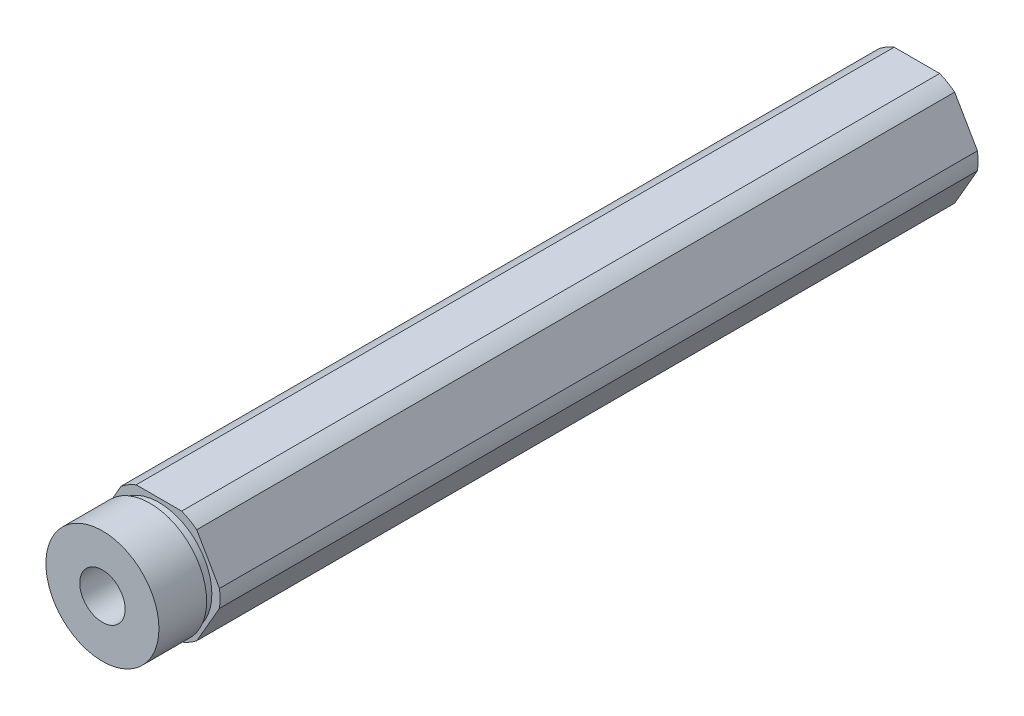
ISO-10303-21;
HEADER;
FILE_DESCRIPTION(('STEP AP214'),'2;1');
FILE_NAME('part.step','',(''),(''),'','','');
FILE_SCHEMA(('AUTOMOTIVE_DESIGN { 1 0 10303 214 1 1 1 1 }'));
ENDSEC;
DATA;
#1=APPLICATION_CONTEXT('core data for automotive mechanical design processes');
#2=APPLICATION_PROTOCOL_DEFINITION('international standard','automotive_design',2000,#1);
#3=PRODUCT_CONTEXT('',#1,'mechanical');
#4=PRODUCT('Part','Part','',(#3));
#5=PRODUCT_RELATED_PRODUCT_CATEGORY('part','',(#4));
#6=PRODUCT_DEFINITION_FORMATION('','',#4);
#7=PRODUCT_DEFINITION_CONTEXT('part definition',#1,'design');
#8=PRODUCT_DEFINITION('design','',#6,#7);
#9=PRODUCT_DEFINITION_SHAPE('','',#8);
#10=(LENGTH_UNIT() NAMED_UNIT(*) SI_UNIT(.MILLI.,.METRE.));
#11=(NAMED_UNIT(*) PLANE_ANGLE_UNIT() SI_UNIT($,.RADIAN.));
#12=(NAMED_UNIT(*) SI_UNIT($,.STERADIAN.) SOLID_ANGLE_UNIT());
#13=UNCERTAINTY_MEASURE_WITH_UNIT(LENGTH_MEASURE(1.E-05),#10,'distance_accuracy_value','');
#14=(GEOMETRIC_REPRESENTATION_CONTEXT(3) GLOBAL_UNCERTAINTY_ASSIGNED_CONTEXT((#13)) GLOBAL_UNIT_ASSIGNED_CONTEXT((#10,
#11,#12)) REPRESENTATION_CONTEXT('',''));
#15=CARTESIAN_POINT('',(0.,0.,0.));
#16=DIRECTION('',(0.,0.,1.));
#17=DIRECTION('',(1.,0.,0.));
#18=AXIS2_PLACEMENT_3D('',#15,#16,#17);
#19=CARTESIAN_POINT('',(0.,0.,-228.6));
#20=DIRECTION('',(0.,0.,1.));
#21=DIRECTION('',(1.,0.,0.));
#22=AXIS2_PLACEMENT_3D('',#19,#20,#21);
#23=CYLINDRICAL_SURFACE('',#22,6.87);
#24=DIRECTION('',(0.,0.,1.));
#25=VECTOR('',#24,1.);
#26=CARTESIAN_POINT('',(6.80102150534208,0.97108520937895,228.6));
#27=LINE('',#26,#25);
#28=CARTESIAN_POINT('',(6.80102150534208,0.971085209378948,-228.6));
#29=VERTEX_POINT('',#28);
#30=CARTESIAN_POINT('',(6.80102150534208,0.971085209378948,-143.4465));
#31=VERTEX_POINT('',#30);
#32=EDGE_CURVE('E182',#29,#31,#27,.T.);
#33=ORIENTED_EDGE('',*,*,#32,.T.);
#34=CARTESIAN_POINT('',(0.,0.,-143.4465));
#35=DIRECTION('',(0.,0.,1.));
#36=DIRECTION('',(1.,0.,0.));
#37=AXIS2_PLACEMENT_3D('',#34,#35,#36);
#38=CIRCLE('',#37,6.87);
#39=CARTESIAN_POINT('',(6.80102150534208,-0.971085209378954,-143.4465));
#40=VERTEX_POINT('',#39);
#41=EDGE_CURVE('E125',#31,#40,#38,.F.);
#42=ORIENTED_EDGE('',*,*,#41,.T.);
#43=DIRECTION('',(0.,0.,1.));
#44=VECTOR('',#43,1.);
#45=CARTESIAN_POINT('',(6.80102150534208,-0.971085209378955,228.6));
#46=LINE('',#45,#44);
#47=CARTESIAN_POINT('',(6.80102150534208,-0.971085209378953,-228.6));
#48=VERTEX_POINT('',#47);
#49=EDGE_CURVE('E119',#40,#48,#46,.F.);
#50=ORIENTED_EDGE('',*,*,#49,.T.);
#51=CARTESIAN_POINT('',(0.,0.,-228.6));
#52=DIRECTION('',(0.,0.,1.));
#53=DIRECTION('',(1.,0.,0.));
#54=AXIS2_PLACEMENT_3D('',#51,#52,#53);
#55=CIRCLE('',#54,6.87);
#56=EDGE_CURVE('E122',#48,#29,#55,.T.);
#57=ORIENTED_EDGE('',*,*,#56,.T.);
#58=EDGE_LOOP('',(#33,#42,#50,#57));
#59=FACE_BOUND('',#58,.T.);
#60=ADVANCED_FACE('F43',(#59),#23,.T.);
#61=CARTESIAN_POINT('',(3.68083890619154,6.3754,228.6));
#62=DIRECTION('',(0.,-1.,0.));
#63=DIRECTION('',(1.,0.,0.));
#64=AXIS2_PLACEMENT_3D('',#61,#62,#63);
#65=PLANE('',#64);
#66=DIRECTION('',(-1.,0.,0.));
#67=VECTOR('',#66,1.);
#68=CARTESIAN_POINT('',(3.68083890619154,6.3754,-143.4465));
#69=LINE('',#68,#67);
#70=CARTESIAN_POINT('',(2.55952629210953,6.37540000000001,-143.4465));
#71=VERTEX_POINT('',#70);
#72=CARTESIAN_POINT('',(-2.55952629210953,6.3754,-143.4465));
#73=VERTEX_POINT('',#72);
#74=EDGE_CURVE('E301',#71,#73,#69,.T.);
#75=ORIENTED_EDGE('',*,*,#74,.F.);
#76=DIRECTION('',(0.,0.,1.));
#77=VECTOR('',#76,1.);
#78=CARTESIAN_POINT('',(2.55952629210953,6.37540000000001,-228.6));
#79=LINE('',#78,#77);
#80=CARTESIAN_POINT('',(2.55952629210953,6.37540000000001,-228.6));
#81=VERTEX_POINT('',#80);
#82=EDGE_CURVE('E179',#81,#71,#79,.T.);
#83=ORIENTED_EDGE('',*,*,#82,.F.);
#84=DIRECTION('',(1.,0.,0.));
#85=VECTOR('',#84,1.);
#86=CARTESIAN_POINT('',(0.,6.3754,-228.6));
#87=LINE('',#86,#85);
#88=CARTESIAN_POINT('',(-2.55952629210953,6.37540000000001,-228.6));
#89=VERTEX_POINT('',#88);
#90=EDGE_CURVE('E175',#81,#89,#87,.F.);
#91=ORIENTED_EDGE('',*,*,#90,.T.);
#92=DIRECTION('',(0.,0.,1.));
#93=VECTOR('',#92,1.);
#94=CARTESIAN_POINT('',(-2.55952629210953,6.37540000000001,-228.6));
#95=LINE('',#94,#93);
#96=EDGE_CURVE('E144',#73,#89,#95,.F.);
#97=ORIENTED_EDGE('',*,*,#96,.F.);
#98=EDGE_LOOP('',(#75,#83,#91,#97));
#99=FACE_BOUND('',#98,.T.);
#100=ADVANCED_FACE('F249',(#99),#65,.F.);
#101=CARTESIAN_POINT('',(0.,0.,-228.6));
#102=DIRECTION('',(0.,0.,1.));
#103=DIRECTION('',(1.,0.,0.));
#104=AXIS2_PLACEMENT_3D('',#101,#102,#103);
#105=CYLINDRICAL_SURFACE('',#104,6.87);
#106=DIRECTION('',(0.,0.,1.));
#107=VECTOR('',#106,1.);
#108=CARTESIAN_POINT('',(-4.24149521323255,5.40431479062104,228.6));
#109=LINE('',#108,#107);
#110=CARTESIAN_POINT('',(-4.24149521323255,5.40431479062105,-228.6));
#111=VERTEX_POINT('',#110);
#112=CARTESIAN_POINT('',(-4.24149521323255,5.40431479062104,-143.4465));
#113=VERTEX_POINT('',#112);
#114=EDGE_CURVE('E206',#111,#113,#109,.T.);
#115=ORIENTED_EDGE('',*,*,#114,.T.);
#116=CARTESIAN_POINT('',(0.,0.,-143.4465));
#117=DIRECTION('',(0.,0.,1.));
#118=DIRECTION('',(1.,0.,0.));
#119=AXIS2_PLACEMENT_3D('',#116,#117,#118);
#120=CIRCLE('',#119,6.87);
#121=EDGE_CURVE('E145',#113,#73,#120,.F.);
#122=ORIENTED_EDGE('',*,*,#121,.T.);
#123=ORIENTED_EDGE('',*,*,#96,.T.);
#124=CARTESIAN_POINT('',(0.,0.,-228.6));
#125=DIRECTION('',(0.,0.,1.));
#126=DIRECTION('',(1.,0.,0.));
#127=AXIS2_PLACEMENT_3D('',#124,#125,#126);
#128=CIRCLE('',#127,6.87);
#129=EDGE_CURVE('E174',#89,#111,#128,.T.);
#130=ORIENTED_EDGE('',*,*,#129,.T.);
#131=EDGE_LOOP('',(#115,#122,#123,#130));
#132=FACE_BOUND('',#131,.T.);
#133=ADVANCED_FACE('F253',(#132),#105,.T.);
#134=CARTESIAN_POINT('',(-3.68083890619154,6.3754,228.6));
#135=DIRECTION('',(0.866025403784439,-0.5,0.));
#136=DIRECTION('',(0.5,0.866025403784439,0.));
#137=AXIS2_PLACEMENT_3D('',#134,#135,#136);
#138=PLANE('',#137);
#139=DIRECTION('',(-0.5,-0.866025403784439,0.));
#140=VECTOR('',#139,1.);
#141=CARTESIAN_POINT('',(-3.68083890619154,6.3754,-143.4465));
#142=LINE('',#141,#140);
#143=CARTESIAN_POINT('',(-6.80102150534208,0.971085209378959,-143.4465));
#144=VERTEX_POINT('',#143);
#145=EDGE_CURVE('E338',#113,#144,#142,.T.);
#146=ORIENTED_EDGE('',*,*,#145,.F.);
#147=ORIENTED_EDGE('',*,*,#114,.F.);
#148=DIRECTION('',(-0.5,-0.866025403784439,0.));
#149=VECTOR('',#148,1.);
#150=CARTESIAN_POINT('',(-4.24149521323255,5.40431479062104,-228.6));
#151=LINE('',#150,#149);
#152=CARTESIAN_POINT('',(-6.80102150534208,0.971085209378961,-228.6));
#153=VERTEX_POINT('',#152);
#154=EDGE_CURVE('E171',#111,#153,#151,.T.);
#155=ORIENTED_EDGE('',*,*,#154,.T.);
#156=DIRECTION('',(0.,0.,1.));
#157=VECTOR('',#156,1.);
#158=CARTESIAN_POINT('',(-6.80102150534208,0.971085209378959,-228.6));
#159=LINE('',#158,#157);
#160=EDGE_CURVE('E203',#144,#153,#159,.F.);
#161=ORIENTED_EDGE('',*,*,#160,.F.);
#162=EDGE_LOOP('',(#146,#147,#155,#161));
#163=FACE_BOUND('',#162,.T.);
#164=ADVANCED_FACE('F258',(#163),#138,.F.);
#165=CARTESIAN_POINT('',(0.,0.,-228.6));
#166=DIRECTION('',(0.,0.,1.));
#167=DIRECTION('',(1.,0.,0.));
#168=AXIS2_PLACEMENT_3D('',#165,#166,#167);
#169=CYLINDRICAL_SURFACE('',#168,6.87);
#170=DIRECTION('',(0.,0.,1.));
#171=VECTOR('',#170,1.);
#172=CARTESIAN_POINT('',(-6.80102150534208,-0.971085209378956,228.6));
#173=LINE('',#172,#171);
#174=CARTESIAN_POINT('',(-6.80102150534208,-0.971085209378956,-228.6));
#175=VERTEX_POINT('',#174);
#176=CARTESIAN_POINT('',(-6.80102150534208,-0.971085209378956,-143.4465));
#177=VERTEX_POINT('',#176);
#178=EDGE_CURVE('E199',#175,#177,#173,.T.);
#179=ORIENTED_EDGE('',*,*,#178,.T.);
#180=CARTESIAN_POINT('',(0.,0.,-143.4465));
#181=DIRECTION('',(0.,0.,1.));
#182=DIRECTION('',(1.,0.,0.));
#183=AXIS2_PLACEMENT_3D('',#180,#181,#182);
#184=CIRCLE('',#183,6.87);
#185=EDGE_CURVE('E334',#177,#144,#184,.F.);
#186=ORIENTED_EDGE('',*,*,#185,.T.);
#187=ORIENTED_EDGE('',*,*,#160,.T.);
#188=CARTESIAN_POINT('',(0.,0.,-228.6));
#189=DIRECTION('',(0.,0.,1.));
#190=DIRECTION('',(1.,0.,0.));
#191=AXIS2_PLACEMENT_3D('',#188,#189,#190);
#192=CIRCLE('',#191,6.87);
#193=EDGE_CURVE('E170',#153,#175,#192,.T.);
#194=ORIENTED_EDGE('',*,*,#193,.T.);
#195=EDGE_LOOP('',(#179,#186,#187,#194));
#196=FACE_BOUND('',#195,.T.);
#197=ADVANCED_FACE('F265',(#196),#169,.T.);
#198=CARTESIAN_POINT('',(-7.36167781238308,0.,228.6));
#199=DIRECTION('',(0.866025403784439,0.5,0.));
#200=DIRECTION('',(-0.5,0.866025403784439,0.));
#201=AXIS2_PLACEMENT_3D('',#198,#199,#200);
#202=PLANE('',#201);
#203=DIRECTION('',(0.5,-0.866025403784439,0.));
#204=VECTOR('',#203,1.);
#205=CARTESIAN_POINT('',(-7.36167781238308,0.,-143.4465));
#206=LINE('',#205,#204);
#207=CARTESIAN_POINT('',(-4.24149521323255,-5.40431479062105,-143.4465));
#208=VERTEX_POINT('',#207);
#209=EDGE_CURVE('E330',#177,#208,#206,.T.);
#210=ORIENTED_EDGE('',*,*,#209,.F.);
#211=ORIENTED_EDGE('',*,*,#178,.F.);
#212=DIRECTION('',(0.5,-0.866025403784438,0.));
#213=VECTOR('',#212,1.);
#214=CARTESIAN_POINT('',(-6.80102150534208,-0.971085209378956,-228.6));
#215=LINE('',#214,#213);
#216=CARTESIAN_POINT('',(-4.24149521323254,-5.40431479062105,-228.6));
#217=VERTEX_POINT('',#216);
#218=EDGE_CURVE('E166',#175,#217,#215,.T.);
#219=ORIENTED_EDGE('',*,*,#218,.T.);
#220=DIRECTION('',(0.,0.,1.));
#221=VECTOR('',#220,1.);
#222=CARTESIAN_POINT('',(-4.24149521323255,-5.40431479062105,-228.6));
#223=LINE('',#222,#221);
#224=EDGE_CURVE('E196',#208,#217,#223,.F.);
#225=ORIENTED_EDGE('',*,*,#224,.F.);
#226=EDGE_LOOP('',(#210,#211,#219,#225));
#227=FACE_BOUND('',#226,.T.);
#228=ADVANCED_FACE('F269',(#227),#202,.F.);
#229=CARTESIAN_POINT('',(0.,0.,-228.6));
#230=DIRECTION('',(0.,0.,1.));
#231=DIRECTION('',(1.,0.,0.));
#232=AXIS2_PLACEMENT_3D('',#229,#230,#231);
#233=CYLINDRICAL_SURFACE('',#232,6.87);
#234=DIRECTION('',(0.,0.,1.));
#235=VECTOR('',#234,1.);
#236=CARTESIAN_POINT('',(-2.55952629210953,-6.3754,228.6));
#237=LINE('',#236,#235);
#238=CARTESIAN_POINT('',(-2.55952629210953,-6.3754,-228.6));
#239=VERTEX_POINT('',#238);
#240=CARTESIAN_POINT('',(-2.55952629210953,-6.3754,-143.4465));
#241=VERTEX_POINT('',#240);
#242=EDGE_CURVE('E192',#239,#241,#237,.T.);
#243=ORIENTED_EDGE('',*,*,#242,.T.);
#244=CARTESIAN_POINT('',(0.,0.,-143.4465));
#245=DIRECTION('',(0.,0.,1.));
#246=DIRECTION('',(1.,0.,0.));
#247=AXIS2_PLACEMENT_3D('',#244,#245,#246);
#248=CIRCLE('',#247,6.87);
#249=EDGE_CURVE('E326',#241,#208,#248,.F.);
#250=ORIENTED_EDGE('',*,*,#249,.T.);
#251=ORIENTED_EDGE('',*,*,#224,.T.);
#252=CARTESIAN_POINT('',(0.,0.,-228.6));
#253=DIRECTION('',(0.,0.,1.));
#254=DIRECTION('',(1.,0.,0.));
#255=AXIS2_PLACEMENT_3D('',#252,#253,#254);
#256=CIRCLE('',#255,6.87);
#257=EDGE_CURVE('E165',#217,#239,#256,.T.);
#258=ORIENTED_EDGE('',*,*,#257,.T.);
#259=EDGE_LOOP('',(#243,#250,#251,#258));
#260=FACE_BOUND('',#259,.T.);
#261=ADVANCED_FACE('F273',(#260),#233,.T.);
#262=CARTESIAN_POINT('',(-3.68083890619154,-6.3754,228.6));
#263=DIRECTION('',(0.,1.,0.));
#264=DIRECTION('',(0.,0.,1.));
#265=AXIS2_PLACEMENT_3D('',#262,#263,#264);
#266=PLANE('',#265);
#267=DIRECTION('',(1.,0.,0.));
#268=VECTOR('',#267,1.);
#269=CARTESIAN_POINT('',(-3.68083890619154,-6.3754,-143.4465));
#270=LINE('',#269,#268);
#271=CARTESIAN_POINT('',(2.55952629210953,-6.37540000000001,-143.4465));
#272=VERTEX_POINT('',#271);
#273=EDGE_CURVE('E323',#241,#272,#270,.T.);
#274=ORIENTED_EDGE('',*,*,#273,.F.);
#275=ORIENTED_EDGE('',*,*,#242,.F.);
#276=DIRECTION('',(1.,0.,0.));
#277=VECTOR('',#276,1.);
#278=CARTESIAN_POINT('',(0.,-6.3754,-228.6));
#279=LINE('',#278,#277);
#280=CARTESIAN_POINT('',(2.55952629210953,-6.3754,-228.6));
#281=VERTEX_POINT('',#280);
#282=EDGE_CURVE('E158',#239,#281,#279,.T.);
#283=ORIENTED_EDGE('',*,*,#282,.T.);
#284=DIRECTION('',(0.,0.,1.));
#285=VECTOR('',#284,1.);
#286=CARTESIAN_POINT('',(2.55952629210953,-6.3754,-228.6));
#287=LINE('',#286,#285);
#288=EDGE_CURVE('E131',#272,#281,#287,.F.);
#289=ORIENTED_EDGE('',*,*,#288,.F.);
#290=EDGE_LOOP('',(#274,#275,#283,#289));
#291=FACE_BOUND('',#290,.T.);
#292=ADVANCED_FACE('F277',(#291),#266,.F.);
#293=CARTESIAN_POINT('',(0.,0.,-228.6));
#294=DIRECTION('',(0.,0.,1.));
#295=DIRECTION('',(1.,0.,0.));
#296=AXIS2_PLACEMENT_3D('',#293,#294,#295);
#297=CYLINDRICAL_SURFACE('',#296,6.87);
#298=DIRECTION('',(0.,0.,1.));
#299=VECTOR('',#298,1.);
#300=CARTESIAN_POINT('',(4.24149521323254,-5.40431479062105,228.6));
#301=LINE('',#300,#299);
#302=CARTESIAN_POINT('',(4.24149521323254,-5.40431479062105,-228.6));
#303=VERTEX_POINT('',#302);
#304=CARTESIAN_POINT('',(4.24149521323254,-5.40431479062105,-143.4465));
#305=VERTEX_POINT('',#304);
#306=EDGE_CURVE('E130',#303,#305,#301,.T.);
#307=ORIENTED_EDGE('',*,*,#306,.T.);
#308=CARTESIAN_POINT('',(0.,0.,-143.4465));
#309=DIRECTION('',(0.,0.,1.));
#310=DIRECTION('',(1.,0.,0.));
#311=AXIS2_PLACEMENT_3D('',#308,#309,#310);
#312=CIRCLE('',#311,6.87);
#313=EDGE_CURVE('E319',#305,#272,#312,.F.);
#314=ORIENTED_EDGE('',*,*,#313,.T.);
#315=ORIENTED_EDGE('',*,*,#288,.T.);
#316=CARTESIAN_POINT('',(0.,0.,-228.6));
#317=DIRECTION('',(0.,0.,1.));
#318=DIRECTION('',(1.,0.,0.));
#319=AXIS2_PLACEMENT_3D('',#316,#317,#318);
#320=CIRCLE('',#319,6.87);
#321=EDGE_CURVE('E150',#281,#303,#320,.T.);
#322=ORIENTED_EDGE('',*,*,#321,.T.);
#323=EDGE_LOOP('',(#307,#314,#315,#322));
#324=FACE_BOUND('',#323,.T.);
#325=ADVANCED_FACE('F281',(#324),#297,.T.);
#326=CARTESIAN_POINT('',(3.68083890619154,-6.3754,228.6));
#327=DIRECTION('',(-0.866025403784439,0.5,0.));
#328=DIRECTION('',(-0.5,-0.866025403784439,0.));
#329=AXIS2_PLACEMENT_3D('',#326,#327,#328);
#330=PLANE('',#329);
#331=DIRECTION('',(0.5,0.866025403784439,0.));
#332=VECTOR('',#331,1.);
#333=CARTESIAN_POINT('',(3.68083890619154,-6.3754,-143.4465));
#334=LINE('',#333,#332);
#335=EDGE_CURVE('E310',#305,#40,#334,.T.);
#336=ORIENTED_EDGE('',*,*,#335,.F.);
#337=ORIENTED_EDGE('',*,*,#306,.F.);
#338=DIRECTION('',(0.5,0.866025403784439,0.));
#339=VECTOR('',#338,1.);
#340=CARTESIAN_POINT('',(4.24149521323254,-5.40431479062105,-228.6));
#341=LINE('',#340,#339);
#342=EDGE_CURVE('E139',#303,#48,#341,.T.);
#343=ORIENTED_EDGE('',*,*,#342,.T.);
#344=ORIENTED_EDGE('',*,*,#49,.F.);
#345=EDGE_LOOP('',(#336,#337,#343,#344));
#346=FACE_BOUND('',#345,.T.);
#347=ADVANCED_FACE('F147',(#346),#330,.F.);
#348=CARTESIAN_POINT('',(7.36167781238308,0.,228.6));
#349=DIRECTION('',(-0.866025403784439,-0.5,0.));
#350=DIRECTION('',(0.5,-0.866025403784439,0.));
#351=AXIS2_PLACEMENT_3D('',#348,#349,#350);
#352=PLANE('',#351);
#353=DIRECTION('',(-0.5,0.866025403784439,0.));
#354=VECTOR('',#353,1.);
#355=CARTESIAN_POINT('',(7.36167781238308,0.,-143.4465));
#356=LINE('',#355,#354);
#357=CARTESIAN_POINT('',(4.24149521323254,5.40431479062105,-143.4465));
#358=VERTEX_POINT('',#357);
#359=EDGE_CURVE('E61',#31,#358,#356,.T.);
#360=ORIENTED_EDGE('',*,*,#359,.F.);
#361=ORIENTED_EDGE('',*,*,#32,.F.);
#362=DIRECTION('',(-0.5,0.866025403784438,0.));
#363=VECTOR('',#362,1.);
#364=CARTESIAN_POINT('',(6.80102150534208,0.97108520937895,-228.6));
#365=LINE('',#364,#363);
#366=CARTESIAN_POINT('',(4.24149521323254,5.40431479062105,-228.6));
#367=VERTEX_POINT('',#366);
#368=EDGE_CURVE('E142',#29,#367,#365,.T.);
#369=ORIENTED_EDGE('',*,*,#368,.T.);
#370=DIRECTION('',(0.,0.,1.));
#371=VECTOR('',#370,1.);
#372=CARTESIAN_POINT('',(4.24149521323254,5.40431479062105,-228.6));
#373=LINE('',#372,#371);
#374=EDGE_CURVE('E71',#358,#367,#373,.F.);
#375=ORIENTED_EDGE('',*,*,#374,.F.);
#376=EDGE_LOOP('',(#360,#361,#369,#375));
#377=FACE_BOUND('',#376,.T.);
#378=ADVANCED_FACE('F288',(#377),#352,.F.);
#379=CARTESIAN_POINT('',(0.,0.,-228.6));
#380=DIRECTION('',(0.,0.,1.));
#381=DIRECTION('',(1.,0.,0.));
#382=AXIS2_PLACEMENT_3D('',#379,#380,#381);
#383=CYLINDRICAL_SURFACE('',#382,6.87);
#384=ORIENTED_EDGE('',*,*,#82,.T.);
#385=CARTESIAN_POINT('',(0.,0.,-143.4465));
#386=DIRECTION('',(0.,0.,1.));
#387=DIRECTION('',(1.,0.,0.));
#388=AXIS2_PLACEMENT_3D('',#385,#386,#387);
#389=CIRCLE('',#388,6.87);
#390=EDGE_CURVE('E12',#71,#358,#389,.F.);
#391=ORIENTED_EDGE('',*,*,#390,.T.);
#392=ORIENTED_EDGE('',*,*,#374,.T.);
#393=CARTESIAN_POINT('',(0.,0.,-228.6));
#394=DIRECTION('',(0.,0.,1.));
#395=DIRECTION('',(1.,0.,0.));
#396=AXIS2_PLACEMENT_3D('',#393,#394,#395);
#397=CIRCLE('',#396,6.87);
#398=EDGE_CURVE('E156',#367,#81,#397,.T.);
#399=ORIENTED_EDGE('',*,*,#398,.T.);
#400=EDGE_LOOP('',(#384,#391,#392,#399));
#401=FACE_BOUND('',#400,.T.);
#402=ADVANCED_FACE('F245',(#401),#383,.T.);
#403=CARTESIAN_POINT('',(-2.82023959282445E-13,1.4720368028756E-13,-137.0965));
#404=DIRECTION('',(0.,0.,1.));
#405=DIRECTION('',(1.,0.,0.));
#406=AXIS2_PLACEMENT_3D('',#403,#404,#405);
#407=PLANE('',#406);
#408=CARTESIAN_POINT('',(0.,0.,-137.0965));
#409=DIRECTION('',(0.,0.,1.));
#410=DIRECTION('',(1.,0.,0.));
#411=AXIS2_PLACEMENT_3D('',#408,#409,#410);
#412=CIRCLE('',#411,2.55);
#413=CARTESIAN_POINT('',(2.55,0.,-137.0965));
#414=VERTEX_POINT('',#413);
#415=EDGE_CURVE('E51',#414,#414,#412,.F.);
#416=ORIENTED_EDGE('',*,*,#415,.T.);
#417=EDGE_LOOP('',(#416));
#418=FACE_BOUND('',#417,.T.);
#419=CARTESIAN_POINT('',(0.,0.,-137.0965));
#420=DIRECTION('',(0.,0.,1.));
#421=DIRECTION('',(1.,0.,0.));
#422=AXIS2_PLACEMENT_3D('',#419,#420,#421);
#423=CIRCLE('',#422,6.35);
#424=CARTESIAN_POINT('',(6.35,0.,-137.0965));
#425=VERTEX_POINT('',#424);
#426=EDGE_CURVE('E397',#425,#425,#423,.T.);
#427=ORIENTED_EDGE('',*,*,#426,.T.);
#428=EDGE_LOOP('',(#427));
#429=FACE_BOUND('',#428,.T.);
#430=ADVANCED_FACE('F232',(#418,#429),#407,.T.);
#431=CARTESIAN_POINT('',(0.,0.,-228.6));
#432=DIRECTION('',(0.,0.,1.));
#433=DIRECTION('',(1.,0.,0.));
#434=AXIS2_PLACEMENT_3D('',#431,#432,#433);
#435=CYLINDRICAL_SURFACE('',#434,2.55);
#436=CARTESIAN_POINT('',(0.,0.,-228.6));
#437=DIRECTION('',(0.,0.,1.));
#438=DIRECTION('',(1.,0.,0.));
#439=AXIS2_PLACEMENT_3D('',#436,#437,#438);
#440=CIRCLE('',#439,2.55);
#441=CARTESIAN_POINT('',(2.55,0.,-228.6));
#442=VERTEX_POINT('',#441);
#443=EDGE_CURVE('E212',#442,#442,#440,.T.);
#444=ORIENTED_EDGE('',*,*,#443,.F.);
#445=EDGE_LOOP('',(#444));
#446=FACE_BOUND('',#445,.T.);
#447=ORIENTED_EDGE('',*,*,#415,.F.);
#448=EDGE_LOOP('',(#447));
#449=FACE_BOUND('',#448,.T.);
#450=ADVANCED_FACE('F235',(#446,#449),#435,.F.);
#451=CARTESIAN_POINT('',(0.,0.,-228.6));
#452=DIRECTION('',(0.,0.,1.));
#453=DIRECTION('',(1.,0.,0.));
#454=AXIS2_PLACEMENT_3D('',#451,#452,#453);
#455=PLANE('',#454);
#456=ORIENTED_EDGE('',*,*,#368,.F.);
#457=ORIENTED_EDGE('',*,*,#56,.F.);
#458=ORIENTED_EDGE('',*,*,#342,.F.);
#459=ORIENTED_EDGE('',*,*,#321,.F.);
#460=ORIENTED_EDGE('',*,*,#282,.F.);
#461=ORIENTED_EDGE('',*,*,#257,.F.);
#462=ORIENTED_EDGE('',*,*,#218,.F.);
#463=ORIENTED_EDGE('',*,*,#193,.F.);
#464=ORIENTED_EDGE('',*,*,#154,.F.);
#465=ORIENTED_EDGE('',*,*,#129,.F.);
#466=ORIENTED_EDGE('',*,*,#90,.F.);
#467=ORIENTED_EDGE('',*,*,#398,.F.);
#468=EDGE_LOOP('',(#456,#457,#458,#459,#460,#461,#462,#463,#464,#465,#466,#467));
#469=FACE_BOUND('',#468,.T.);
#470=ORIENTED_EDGE('',*,*,#443,.T.);
#471=EDGE_LOOP('',(#470));
#472=FACE_BOUND('',#471,.T.);
#473=ADVANCED_FACE('F136',(#469,#472),#455,.F.);
#474=CARTESIAN_POINT('',(0.,8.0571706152348,-143.4465));
#475=DIRECTION('',(0.,0.,1.));
#476=DIRECTION('',(1.,0.,0.));
#477=AXIS2_PLACEMENT_3D('',#474,#475,#476);
#478=PLANE('',#477);
#479=ORIENTED_EDGE('',*,*,#145,.T.);
#480=ORIENTED_EDGE('',*,*,#185,.F.);
#481=ORIENTED_EDGE('',*,*,#209,.T.);
#482=ORIENTED_EDGE('',*,*,#249,.F.);
#483=ORIENTED_EDGE('',*,*,#273,.T.);
#484=ORIENTED_EDGE('',*,*,#313,.F.);
#485=ORIENTED_EDGE('',*,*,#335,.T.);
#486=ORIENTED_EDGE('',*,*,#41,.F.);
#487=ORIENTED_EDGE('',*,*,#359,.T.);
#488=ORIENTED_EDGE('',*,*,#390,.F.);
#489=ORIENTED_EDGE('',*,*,#74,.T.);
#490=ORIENTED_EDGE('',*,*,#121,.F.);
#491=EDGE_LOOP('',(#479,#480,#481,#482,#483,#484,#485,#486,#487,#488,#489,#490));
#492=FACE_BOUND('',#491,.T.);
#493=CARTESIAN_POINT('',(0.,0.,-143.4465));
#494=DIRECTION('',(0.,0.,1.));
#495=DIRECTION('',(1.,0.,0.));
#496=AXIS2_PLACEMENT_3D('',#493,#494,#495);
#497=CIRCLE('',#496,5.9436);
#498=CARTESIAN_POINT('',(5.9436,0.,-143.4465));
#499=VERTEX_POINT('',#498);
#500=EDGE_CURVE('E313',#499,#499,#497,.T.);
#501=ORIENTED_EDGE('',*,*,#500,.F.);
#502=EDGE_LOOP('',(#501));
#503=FACE_BOUND('',#502,.T.);
#504=ADVANCED_FACE('F243',(#492,#503),#478,.T.);
#505=CARTESIAN_POINT('',(0.,0.,0.));
#506=DIRECTION('',(0.,0.,1.));
#507=DIRECTION('',(1.,0.,0.));
#508=AXIS2_PLACEMENT_3D('',#505,#506,#507);
#509=CYLINDRICAL_SURFACE('',#508,5.9436);
#510=ORIENTED_EDGE('',*,*,#500,.T.);
#511=EDGE_LOOP('',(#510));
#512=FACE_BOUND('',#511,.T.);
#513=CARTESIAN_POINT('',(0.,0.,-142.4559));
#514=DIRECTION('',(0.,0.,1.));
#515=DIRECTION('',(1.,0.,0.));
#516=AXIS2_PLACEMENT_3D('',#513,#514,#515);
#517=CIRCLE('',#516,5.9436);
#518=CARTESIAN_POINT('',(5.9436,0.,-142.4559));
#519=VERTEX_POINT('',#518);
#520=EDGE_CURVE('E388',#519,#519,#517,.T.);
#521=ORIENTED_EDGE('',*,*,#520,.F.);
#522=EDGE_LOOP('',(#521));
#523=FACE_BOUND('',#522,.T.);
#524=ADVANCED_FACE('F382',(#512,#523),#509,.T.);
#525=CARTESIAN_POINT('',(0.,5.9436,-142.4559));
#526=DIRECTION('',(0.,0.,-1.));
#527=DIRECTION('',(-1.,0.,0.));
#528=AXIS2_PLACEMENT_3D('',#525,#526,#527);
#529=PLANE('',#528);
#530=ORIENTED_EDGE('',*,*,#520,.T.);
#531=EDGE_LOOP('',(#530));
#532=FACE_BOUND('',#531,.T.);
#533=CARTESIAN_POINT('',(0.,0.,-142.4559));
#534=DIRECTION('',(0.,0.,1.));
#535=DIRECTION('',(1.,0.,0.));
#536=AXIS2_PLACEMENT_3D('',#533,#534,#535);
#537=CIRCLE('',#536,6.35);
#538=CARTESIAN_POINT('',(6.35,0.,-142.4559));
#539=VERTEX_POINT('',#538);
#540=EDGE_CURVE('E391',#539,#539,#537,.T.);
#541=ORIENTED_EDGE('',*,*,#540,.F.);
#542=EDGE_LOOP('',(#541));
#543=FACE_BOUND('',#542,.T.);
#544=ADVANCED_FACE('F403',(#532,#543),#529,.T.);
#545=CARTESIAN_POINT('',(0.,0.,0.));
#546=DIRECTION('',(0.,0.,1.));
#547=DIRECTION('',(1.,0.,0.));
#548=AXIS2_PLACEMENT_3D('',#545,#546,#547);
#549=CYLINDRICAL_SURFACE('',#548,6.35);
#550=ORIENTED_EDGE('',*,*,#540,.T.);
#551=EDGE_LOOP('',(#550));
#552=FACE_BOUND('',#551,.T.);
#553=ORIENTED_EDGE('',*,*,#426,.F.);
#554=EDGE_LOOP('',(#553));
#555=FACE_BOUND('',#554,.T.);
#556=ADVANCED_FACE('F401',(#552,#555),#549,.T.);
#557=CLOSED_SHELL('',(#60,#100,#133,#164,#197,#228,#261,#292,#325,#347,#378,#402,#430,#450,#473,
#504,#524,#544,#556));
#558=MANIFOLD_SOLID_BREP('B2',#557);
#559=ADVANCED_BREP_SHAPE_REPRESENTATION('',(#18,#558),#14);
#560=SHAPE_DEFINITION_REPRESENTATION(#9,#559);
ENDSEC;
END-ISO-10303-21;
